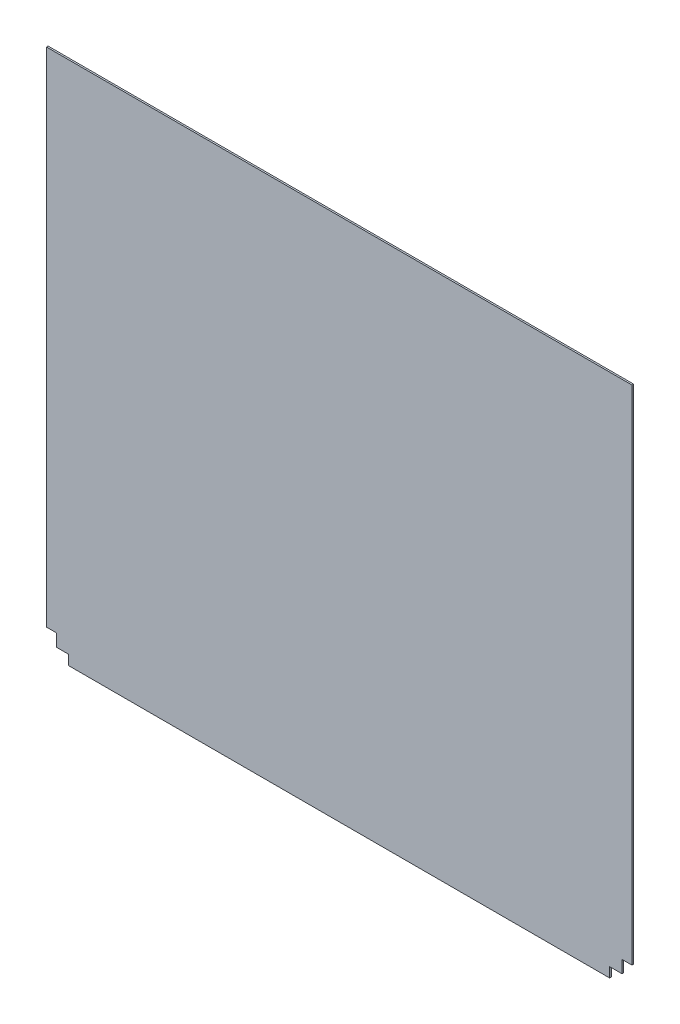
ISO-10303-21;
HEADER;
FILE_DESCRIPTION(('STEP AP214'),'2;1');
FILE_NAME('part.step','',(''),(''),'','','');
FILE_SCHEMA(('AUTOMOTIVE_DESIGN { 1 0 10303 214 1 1 1 1 }'));
ENDSEC;
DATA;
#1=APPLICATION_CONTEXT('core data for automotive mechanical design processes');
#2=APPLICATION_PROTOCOL_DEFINITION('international standard','automotive_design',2000,#1);
#3=PRODUCT_CONTEXT('',#1,'mechanical');
#4=PRODUCT('Part','Part','',(#3));
#5=PRODUCT_RELATED_PRODUCT_CATEGORY('part','',(#4));
#6=PRODUCT_DEFINITION_FORMATION('','',#4);
#7=PRODUCT_DEFINITION_CONTEXT('part definition',#1,'design');
#8=PRODUCT_DEFINITION('design','',#6,#7);
#9=PRODUCT_DEFINITION_SHAPE('','',#8);
#10=(LENGTH_UNIT() NAMED_UNIT(*) SI_UNIT(.MILLI.,.METRE.));
#11=(NAMED_UNIT(*) PLANE_ANGLE_UNIT() SI_UNIT($,.RADIAN.));
#12=(NAMED_UNIT(*) SI_UNIT($,.STERADIAN.) SOLID_ANGLE_UNIT());
#13=UNCERTAINTY_MEASURE_WITH_UNIT(LENGTH_MEASURE(1.E-05),#10,'distance_accuracy_value','');
#14=(GEOMETRIC_REPRESENTATION_CONTEXT(3) GLOBAL_UNCERTAINTY_ASSIGNED_CONTEXT((#13)) GLOBAL_UNIT_ASSIGNED_CONTEXT((#10,
#11,#12)) REPRESENTATION_CONTEXT('',''));
#15=CARTESIAN_POINT('',(0.,0.,0.));
#16=DIRECTION('',(0.,0.,1.));
#17=DIRECTION('',(1.,0.,0.));
#18=AXIS2_PLACEMENT_3D('',#15,#16,#17);
#19=CARTESIAN_POINT('',(872.45698,0.,2.54));
#20=DIRECTION('',(1.,0.,0.));
#21=DIRECTION('',(0.,0.,-1.));
#22=AXIS2_PLACEMENT_3D('',#19,#20,#21);
#23=PLANE('',#22);
#24=DIRECTION('',(0.,-1.,0.));
#25=VECTOR('',#24,1.);
#26=CARTESIAN_POINT('',(872.45698,0.,0.));
#27=LINE('',#26,#25);
#28=CARTESIAN_POINT('',(872.45698,15.24,0.));
#29=VERTEX_POINT('',#28);
#30=CARTESIAN_POINT('',(872.45698,0.,0.));
#31=VERTEX_POINT('',#30);
#32=EDGE_CURVE('E167',#29,#31,#27,.T.);
#33=ORIENTED_EDGE('',*,*,#32,.F.);
#34=DIRECTION('',(0.,0.,-1.));
#35=VECTOR('',#34,1.);
#36=CARTESIAN_POINT('',(872.45698,15.24,2.54));
#37=LINE('',#36,#35);
#38=CARTESIAN_POINT('',(872.45698,15.24,2.54));
#39=VERTEX_POINT('',#38);
#40=EDGE_CURVE('E11',#39,#29,#37,.T.);
#41=ORIENTED_EDGE('',*,*,#40,.F.);
#42=DIRECTION('',(0.,-1.,0.));
#43=VECTOR('',#42,1.);
#44=CARTESIAN_POINT('',(872.45698,0.,2.54));
#45=LINE('',#44,#43);
#46=CARTESIAN_POINT('',(872.45698,0.,2.54));
#47=VERTEX_POINT('',#46);
#48=EDGE_CURVE('E208',#39,#47,#45,.T.);
#49=ORIENTED_EDGE('',*,*,#48,.T.);
#50=DIRECTION('',(0.,0.,-1.));
#51=VECTOR('',#50,1.);
#52=CARTESIAN_POINT('',(872.45698,0.,2.54));
#53=LINE('',#52,#51);
#54=EDGE_CURVE('E110',#47,#31,#53,.T.);
#55=ORIENTED_EDGE('',*,*,#54,.T.);
#56=EDGE_LOOP('',(#33,#41,#49,#55));
#57=FACE_BOUND('',#56,.T.);
#58=ADVANCED_FACE('F46',(#57),#23,.T.);
#59=CARTESIAN_POINT('',(0.,15.2399999999999,2.54));
#60=DIRECTION('',(0.,-1.,0.));
#61=DIRECTION('',(1.,0.,0.));
#62=AXIS2_PLACEMENT_3D('',#59,#60,#61);
#63=PLANE('',#62);
#64=DIRECTION('',(-1.,0.,0.));
#65=VECTOR('',#64,1.);
#66=CARTESIAN_POINT('',(0.,15.2399999999999,0.));
#67=LINE('',#66,#65);
#68=CARTESIAN_POINT('',(891.76098,15.24,0.));
#69=VERTEX_POINT('',#68);
#70=EDGE_CURVE('E171',#69,#29,#67,.T.);
#71=ORIENTED_EDGE('',*,*,#70,.F.);
#72=DIRECTION('',(0.,0.,-1.));
#73=VECTOR('',#72,1.);
#74=CARTESIAN_POINT('',(891.76098,15.24,2.54));
#75=LINE('',#74,#73);
#76=CARTESIAN_POINT('',(891.76098,15.24,2.54));
#77=VERTEX_POINT('',#76);
#78=EDGE_CURVE('E55',#77,#69,#75,.T.);
#79=ORIENTED_EDGE('',*,*,#78,.F.);
#80=DIRECTION('',(-1.,0.,0.));
#81=VECTOR('',#80,1.);
#82=CARTESIAN_POINT('',(0.,15.2399999999999,2.54));
#83=LINE('',#82,#81);
#84=EDGE_CURVE('E255',#77,#39,#83,.T.);
#85=ORIENTED_EDGE('',*,*,#84,.T.);
#86=ORIENTED_EDGE('',*,*,#40,.T.);
#87=EDGE_LOOP('',(#71,#79,#85,#86));
#88=FACE_BOUND('',#87,.T.);
#89=ADVANCED_FACE('F244',(#88),#63,.T.);
#90=CARTESIAN_POINT('',(891.76098,0.,2.54));
#91=DIRECTION('',(1.,0.,0.));
#92=DIRECTION('',(0.,0.,-1.));
#93=AXIS2_PLACEMENT_3D('',#90,#91,#92);
#94=PLANE('',#93);
#95=DIRECTION('',(0.,-1.,0.));
#96=VECTOR('',#95,1.);
#97=CARTESIAN_POINT('',(891.76098,0.,0.));
#98=LINE('',#97,#96);
#99=CARTESIAN_POINT('',(891.76098,34.544,0.));
#100=VERTEX_POINT('',#99);
#101=EDGE_CURVE('E175',#100,#69,#98,.T.);
#102=ORIENTED_EDGE('',*,*,#101,.F.);
#103=DIRECTION('',(0.,0.,-1.));
#104=VECTOR('',#103,1.);
#105=CARTESIAN_POINT('',(891.76098,34.544,2.54));
#106=LINE('',#105,#104);
#107=CARTESIAN_POINT('',(891.76098,34.544,2.54));
#108=VERTEX_POINT('',#107);
#109=EDGE_CURVE('E231',#108,#100,#106,.T.);
#110=ORIENTED_EDGE('',*,*,#109,.F.);
#111=DIRECTION('',(0.,-1.,0.));
#112=VECTOR('',#111,1.);
#113=CARTESIAN_POINT('',(891.76098,0.,2.54));
#114=LINE('',#113,#112);
#115=EDGE_CURVE('E240',#108,#77,#114,.T.);
#116=ORIENTED_EDGE('',*,*,#115,.T.);
#117=ORIENTED_EDGE('',*,*,#78,.T.);
#118=EDGE_LOOP('',(#102,#110,#116,#117));
#119=FACE_BOUND('',#118,.T.);
#120=ADVANCED_FACE('F238',(#119),#94,.T.);
#121=CARTESIAN_POINT('',(0.,34.5439999999996,2.54));
#122=DIRECTION('',(0.,-1.,0.));
#123=DIRECTION('',(1.,0.,0.));
#124=AXIS2_PLACEMENT_3D('',#121,#122,#123);
#125=PLANE('',#124);
#126=DIRECTION('',(-1.,0.,0.));
#127=VECTOR('',#126,1.);
#128=CARTESIAN_POINT('',(0.,34.5439999999996,0.));
#129=LINE('',#128,#127);
#130=CARTESIAN_POINT('',(907.00098,34.544,0.));
#131=VERTEX_POINT('',#130);
#132=EDGE_CURVE('E179',#131,#100,#129,.T.);
#133=ORIENTED_EDGE('',*,*,#132,.F.);
#134=DIRECTION('',(0.,0.,-1.));
#135=VECTOR('',#134,1.);
#136=CARTESIAN_POINT('',(907.00098,34.544,2.54));
#137=LINE('',#136,#135);
#138=CARTESIAN_POINT('',(907.00098,34.544,2.54));
#139=VERTEX_POINT('',#138);
#140=EDGE_CURVE('E228',#139,#131,#137,.T.);
#141=ORIENTED_EDGE('',*,*,#140,.F.);
#142=DIRECTION('',(-1.,0.,0.));
#143=VECTOR('',#142,1.);
#144=CARTESIAN_POINT('',(0.,34.5439999999996,2.54));
#145=LINE('',#144,#143);
#146=EDGE_CURVE('E254',#139,#108,#145,.T.);
#147=ORIENTED_EDGE('',*,*,#146,.T.);
#148=ORIENTED_EDGE('',*,*,#109,.T.);
#149=EDGE_LOOP('',(#133,#141,#147,#148));
#150=FACE_BOUND('',#149,.T.);
#151=ADVANCED_FACE('F250',(#150),#125,.T.);
#152=CARTESIAN_POINT('',(907.00098,0.,2.54));
#153=DIRECTION('',(-1.,0.,0.));
#154=DIRECTION('',(0.,0.,1.));
#155=AXIS2_PLACEMENT_3D('',#152,#153,#154);
#156=PLANE('',#155);
#157=DIRECTION('',(0.,1.,0.));
#158=VECTOR('',#157,1.);
#159=CARTESIAN_POINT('',(907.00098,0.,0.));
#160=LINE('',#159,#158);
#161=CARTESIAN_POINT('',(907.00098,812.8,0.));
#162=VERTEX_POINT('',#161);
#163=EDGE_CURVE('E183',#131,#162,#160,.T.);
#164=ORIENTED_EDGE('',*,*,#163,.T.);
#165=DIRECTION('',(0.,0.,-1.));
#166=VECTOR('',#165,1.);
#167=CARTESIAN_POINT('',(907.00098,812.8,2.54));
#168=LINE('',#167,#166);
#169=CARTESIAN_POINT('',(907.00098,812.8,2.54));
#170=VERTEX_POINT('',#169);
#171=EDGE_CURVE('E225',#170,#162,#168,.T.);
#172=ORIENTED_EDGE('',*,*,#171,.F.);
#173=DIRECTION('',(0.,1.,0.));
#174=VECTOR('',#173,1.);
#175=CARTESIAN_POINT('',(907.00098,0.,2.54));
#176=LINE('',#175,#174);
#177=EDGE_CURVE('E260',#139,#170,#176,.T.);
#178=ORIENTED_EDGE('',*,*,#177,.F.);
#179=ORIENTED_EDGE('',*,*,#140,.T.);
#180=EDGE_LOOP('',(#164,#172,#178,#179));
#181=FACE_BOUND('',#180,.T.);
#182=ADVANCED_FACE('F303',(#181),#156,.F.);
#183=CARTESIAN_POINT('',(0.,812.8,2.54));
#184=DIRECTION('',(0.,1.,0.));
#185=DIRECTION('',(0.,0.,1.));
#186=AXIS2_PLACEMENT_3D('',#183,#184,#185);
#187=PLANE('',#186);
#188=DIRECTION('',(1.,0.,0.));
#189=VECTOR('',#188,1.);
#190=CARTESIAN_POINT('',(0.,812.8,0.));
#191=LINE('',#190,#189);
#192=CARTESIAN_POINT('',(0.,812.8,0.));
#193=VERTEX_POINT('',#192);
#194=EDGE_CURVE('E187',#193,#162,#191,.T.);
#195=ORIENTED_EDGE('',*,*,#194,.F.);
#196=DIRECTION('',(0.,0.,-1.));
#197=VECTOR('',#196,1.);
#198=CARTESIAN_POINT('',(0.,812.8,2.54));
#199=LINE('',#198,#197);
#200=CARTESIAN_POINT('',(0.,812.8,2.54));
#201=VERTEX_POINT('',#200);
#202=EDGE_CURVE('E222',#201,#193,#199,.T.);
#203=ORIENTED_EDGE('',*,*,#202,.F.);
#204=DIRECTION('',(1.,0.,0.));
#205=VECTOR('',#204,1.);
#206=CARTESIAN_POINT('',(0.,812.8,2.54));
#207=LINE('',#206,#205);
#208=EDGE_CURVE('E267',#201,#170,#207,.T.);
#209=ORIENTED_EDGE('',*,*,#208,.T.);
#210=ORIENTED_EDGE('',*,*,#171,.T.);
#211=EDGE_LOOP('',(#195,#203,#209,#210));
#212=FACE_BOUND('',#211,.T.);
#213=ADVANCED_FACE('F306',(#212),#187,.T.);
#214=CARTESIAN_POINT('',(0.,0.,2.54));
#215=DIRECTION('',(-1.,0.,0.));
#216=DIRECTION('',(0.,0.,1.));
#217=AXIS2_PLACEMENT_3D('',#214,#215,#216);
#218=PLANE('',#217);
#219=DIRECTION('',(0.,1.,0.));
#220=VECTOR('',#219,1.);
#221=CARTESIAN_POINT('',(0.,0.,0.));
#222=LINE('',#221,#220);
#223=CARTESIAN_POINT('',(0.,34.544,0.));
#224=VERTEX_POINT('',#223);
#225=EDGE_CURVE('E191',#224,#193,#222,.T.);
#226=ORIENTED_EDGE('',*,*,#225,.F.);
#227=DIRECTION('',(0.,0.,-1.));
#228=VECTOR('',#227,1.);
#229=CARTESIAN_POINT('',(0.,34.544,2.54));
#230=LINE('',#229,#228);
#231=CARTESIAN_POINT('',(0.,34.544,2.54));
#232=VERTEX_POINT('',#231);
#233=EDGE_CURVE('E219',#232,#224,#230,.T.);
#234=ORIENTED_EDGE('',*,*,#233,.F.);
#235=DIRECTION('',(0.,1.,0.));
#236=VECTOR('',#235,1.);
#237=CARTESIAN_POINT('',(0.,0.,2.54));
#238=LINE('',#237,#236);
#239=EDGE_CURVE('E271',#232,#201,#238,.T.);
#240=ORIENTED_EDGE('',*,*,#239,.T.);
#241=ORIENTED_EDGE('',*,*,#202,.T.);
#242=EDGE_LOOP('',(#226,#234,#240,#241));
#243=FACE_BOUND('',#242,.T.);
#244=ADVANCED_FACE('F310',(#243),#218,.T.);
#245=CARTESIAN_POINT('',(0.,34.544,2.54));
#246=DIRECTION('',(0.,1.,0.));
#247=DIRECTION('',(0.,0.,1.));
#248=AXIS2_PLACEMENT_3D('',#245,#246,#247);
#249=PLANE('',#248);
#250=DIRECTION('',(1.,0.,0.));
#251=VECTOR('',#250,1.);
#252=CARTESIAN_POINT('',(0.,34.544,0.));
#253=LINE('',#252,#251);
#254=CARTESIAN_POINT('',(15.24,34.544,0.));
#255=VERTEX_POINT('',#254);
#256=EDGE_CURVE('E195',#224,#255,#253,.T.);
#257=ORIENTED_EDGE('',*,*,#256,.T.);
#258=DIRECTION('',(0.,0.,-1.));
#259=VECTOR('',#258,1.);
#260=CARTESIAN_POINT('',(15.24,34.544,2.54));
#261=LINE('',#260,#259);
#262=CARTESIAN_POINT('',(15.24,34.544,2.54));
#263=VERTEX_POINT('',#262);
#264=EDGE_CURVE('E215',#263,#255,#261,.T.);
#265=ORIENTED_EDGE('',*,*,#264,.F.);
#266=DIRECTION('',(1.,0.,0.));
#267=VECTOR('',#266,1.);
#268=CARTESIAN_POINT('',(0.,34.544,2.54));
#269=LINE('',#268,#267);
#270=EDGE_CURVE('E275',#232,#263,#269,.T.);
#271=ORIENTED_EDGE('',*,*,#270,.F.);
#272=ORIENTED_EDGE('',*,*,#233,.T.);
#273=EDGE_LOOP('',(#257,#265,#271,#272));
#274=FACE_BOUND('',#273,.T.);
#275=ADVANCED_FACE('F283',(#274),#249,.F.);
#276=CARTESIAN_POINT('',(15.24,0.,2.54));
#277=DIRECTION('',(1.,0.,0.));
#278=DIRECTION('',(0.,1.,0.));
#279=AXIS2_PLACEMENT_3D('',#276,#277,#278);
#280=PLANE('',#279);
#281=DIRECTION('',(0.,-1.,0.));
#282=VECTOR('',#281,1.);
#283=CARTESIAN_POINT('',(15.24,0.,0.));
#284=LINE('',#283,#282);
#285=CARTESIAN_POINT('',(15.24,15.24,0.));
#286=VERTEX_POINT('',#285);
#287=EDGE_CURVE('E198',#255,#286,#284,.T.);
#288=ORIENTED_EDGE('',*,*,#287,.T.);
#289=DIRECTION('',(0.,0.,-1.));
#290=VECTOR('',#289,1.);
#291=CARTESIAN_POINT('',(15.24,15.24,2.54));
#292=LINE('',#291,#290);
#293=CARTESIAN_POINT('',(15.24,15.24,2.54));
#294=VERTEX_POINT('',#293);
#295=EDGE_CURVE('E157',#294,#286,#292,.T.);
#296=ORIENTED_EDGE('',*,*,#295,.F.);
#297=DIRECTION('',(0.,-1.,0.));
#298=VECTOR('',#297,1.);
#299=CARTESIAN_POINT('',(15.24,0.,2.54));
#300=LINE('',#299,#298);
#301=EDGE_CURVE('E146',#263,#294,#300,.T.);
#302=ORIENTED_EDGE('',*,*,#301,.F.);
#303=ORIENTED_EDGE('',*,*,#264,.T.);
#304=EDGE_LOOP('',(#288,#296,#302,#303));
#305=FACE_BOUND('',#304,.T.);
#306=ADVANCED_FACE('F287',(#305),#280,.F.);
#307=CARTESIAN_POINT('',(0.,15.24,2.54));
#308=DIRECTION('',(0.,1.,0.));
#309=DIRECTION('',(0.,0.,1.));
#310=AXIS2_PLACEMENT_3D('',#307,#308,#309);
#311=PLANE('',#310);
#312=DIRECTION('',(1.,0.,0.));
#313=VECTOR('',#312,1.);
#314=CARTESIAN_POINT('',(0.,15.24,0.));
#315=LINE('',#314,#313);
#316=CARTESIAN_POINT('',(34.544,15.24,0.));
#317=VERTEX_POINT('',#316);
#318=EDGE_CURVE('E155',#286,#317,#315,.T.);
#319=ORIENTED_EDGE('',*,*,#318,.T.);
#320=DIRECTION('',(0.,0.,-1.));
#321=VECTOR('',#320,1.);
#322=CARTESIAN_POINT('',(34.544,15.24,2.54));
#323=LINE('',#322,#321);
#324=CARTESIAN_POINT('',(34.544,15.24,2.54));
#325=VERTEX_POINT('',#324);
#326=EDGE_CURVE('E152',#325,#317,#323,.T.);
#327=ORIENTED_EDGE('',*,*,#326,.F.);
#328=DIRECTION('',(1.,0.,0.));
#329=VECTOR('',#328,1.);
#330=CARTESIAN_POINT('',(0.,15.24,2.54));
#331=LINE('',#330,#329);
#332=EDGE_CURVE('E140',#294,#325,#331,.T.);
#333=ORIENTED_EDGE('',*,*,#332,.F.);
#334=ORIENTED_EDGE('',*,*,#295,.T.);
#335=EDGE_LOOP('',(#319,#327,#333,#334));
#336=FACE_BOUND('',#335,.T.);
#337=ADVANCED_FACE('F153',(#336),#311,.F.);
#338=CARTESIAN_POINT('',(34.544,0.,2.54));
#339=DIRECTION('',(1.,0.,0.));
#340=DIRECTION('',(0.,0.,-1.));
#341=AXIS2_PLACEMENT_3D('',#338,#339,#340);
#342=PLANE('',#341);
#343=DIRECTION('',(0.,-1.,0.));
#344=VECTOR('',#343,1.);
#345=CARTESIAN_POINT('',(34.544,0.,0.));
#346=LINE('',#345,#344);
#347=CARTESIAN_POINT('',(34.544,0.,0.));
#348=VERTEX_POINT('',#347);
#349=EDGE_CURVE('E103',#317,#348,#346,.T.);
#350=ORIENTED_EDGE('',*,*,#349,.T.);
#351=DIRECTION('',(0.,0.,-1.));
#352=VECTOR('',#351,1.);
#353=CARTESIAN_POINT('',(34.544,0.,2.54));
#354=LINE('',#353,#352);
#355=CARTESIAN_POINT('',(34.544,0.,2.54));
#356=VERTEX_POINT('',#355);
#357=EDGE_CURVE('E158',#356,#348,#354,.T.);
#358=ORIENTED_EDGE('',*,*,#357,.F.);
#359=DIRECTION('',(0.,-1.,0.));
#360=VECTOR('',#359,1.);
#361=CARTESIAN_POINT('',(34.544,0.,2.54));
#362=LINE('',#361,#360);
#363=EDGE_CURVE('E144',#325,#356,#362,.T.);
#364=ORIENTED_EDGE('',*,*,#363,.F.);
#365=ORIENTED_EDGE('',*,*,#326,.T.);
#366=EDGE_LOOP('',(#350,#358,#364,#365));
#367=FACE_BOUND('',#366,.T.);
#368=ADVANCED_FACE('F160',(#367),#342,.F.);
#369=CARTESIAN_POINT('',(0.,0.,2.54));
#370=DIRECTION('',(0.,1.,0.));
#371=DIRECTION('',(0.,0.,1.));
#372=AXIS2_PLACEMENT_3D('',#369,#370,#371);
#373=PLANE('',#372);
#374=DIRECTION('',(1.,0.,0.));
#375=VECTOR('',#374,1.);
#376=CARTESIAN_POINT('',(0.,0.,0.));
#377=LINE('',#376,#375);
#378=EDGE_CURVE('E205',#348,#31,#377,.T.);
#379=ORIENTED_EDGE('',*,*,#378,.T.);
#380=ORIENTED_EDGE('',*,*,#54,.F.);
#381=DIRECTION('',(1.,0.,0.));
#382=VECTOR('',#381,1.);
#383=CARTESIAN_POINT('',(0.,0.,2.54));
#384=LINE('',#383,#382);
#385=EDGE_CURVE('E63',#356,#47,#384,.T.);
#386=ORIENTED_EDGE('',*,*,#385,.F.);
#387=ORIENTED_EDGE('',*,*,#357,.T.);
#388=EDGE_LOOP('',(#379,#380,#386,#387));
#389=FACE_BOUND('',#388,.T.);
#390=ADVANCED_FACE('F290',(#389),#373,.F.);
#391=CARTESIAN_POINT('',(0.,0.,2.54));
#392=DIRECTION('',(0.,0.,1.));
#393=DIRECTION('',(1.,0.,0.));
#394=AXIS2_PLACEMENT_3D('',#391,#392,#393);
#395=PLANE('',#394);
#396=ORIENTED_EDGE('',*,*,#48,.F.);
#397=ORIENTED_EDGE('',*,*,#84,.F.);
#398=ORIENTED_EDGE('',*,*,#115,.F.);
#399=ORIENTED_EDGE('',*,*,#146,.F.);
#400=ORIENTED_EDGE('',*,*,#177,.T.);
#401=ORIENTED_EDGE('',*,*,#208,.F.);
#402=ORIENTED_EDGE('',*,*,#239,.F.);
#403=ORIENTED_EDGE('',*,*,#270,.T.);
#404=ORIENTED_EDGE('',*,*,#301,.T.);
#405=ORIENTED_EDGE('',*,*,#332,.T.);
#406=ORIENTED_EDGE('',*,*,#363,.T.);
#407=ORIENTED_EDGE('',*,*,#385,.T.);
#408=EDGE_LOOP('',(#396,#397,#398,#399,#400,#401,#402,#403,#404,#405,#406,#407));
#409=FACE_BOUND('',#408,.T.);
#410=ADVANCED_FACE('F142',(#409),#395,.T.);
#411=CARTESIAN_POINT('',(0.,0.,0.));
#412=DIRECTION('',(0.,0.,1.));
#413=DIRECTION('',(1.,0.,0.));
#414=AXIS2_PLACEMENT_3D('',#411,#412,#413);
#415=PLANE('',#414);
#416=ORIENTED_EDGE('',*,*,#32,.T.);
#417=ORIENTED_EDGE('',*,*,#378,.F.);
#418=ORIENTED_EDGE('',*,*,#349,.F.);
#419=ORIENTED_EDGE('',*,*,#318,.F.);
#420=ORIENTED_EDGE('',*,*,#287,.F.);
#421=ORIENTED_EDGE('',*,*,#256,.F.);
#422=ORIENTED_EDGE('',*,*,#225,.T.);
#423=ORIENTED_EDGE('',*,*,#194,.T.);
#424=ORIENTED_EDGE('',*,*,#163,.F.);
#425=ORIENTED_EDGE('',*,*,#132,.T.);
#426=ORIENTED_EDGE('',*,*,#101,.T.);
#427=ORIENTED_EDGE('',*,*,#70,.T.);
#428=EDGE_LOOP('',(#416,#417,#418,#419,#420,#421,#422,#423,#424,#425,#426,#427));
#429=FACE_BOUND('',#428,.T.);
#430=ADVANCED_FACE('F246',(#429),#415,.F.);
#431=CLOSED_SHELL('',(#58,#89,#120,#151,#182,#213,#244,#275,#306,#337,#368,#390,#410,#430));
#432=MANIFOLD_SOLID_BREP('B2',#431);
#433=ADVANCED_BREP_SHAPE_REPRESENTATION('',(#18,#432),#14);
#434=SHAPE_DEFINITION_REPRESENTATION(#9,#433);
ENDSEC;
END-ISO-10303-21;
